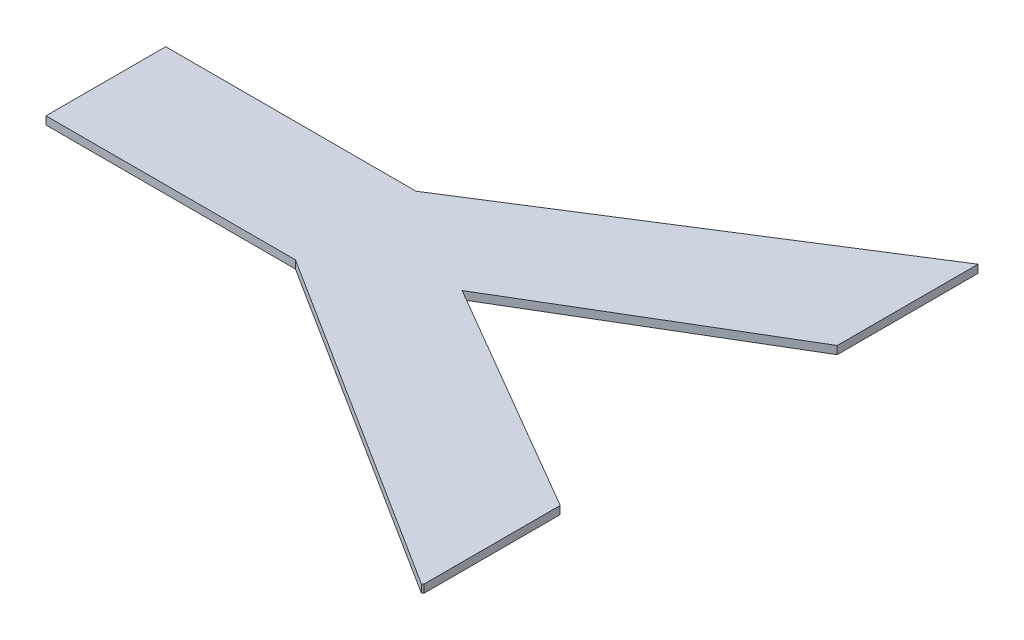
ISO-10303-21;
HEADER;
FILE_DESCRIPTION(('STEP AP214'),'2;1');
FILE_NAME('part.step','',(''),(''),'','','');
FILE_SCHEMA(('AUTOMOTIVE_DESIGN { 1 0 10303 214 1 1 1 1 }'));
ENDSEC;
DATA;
#1=APPLICATION_CONTEXT('core data for automotive mechanical design processes');
#2=APPLICATION_PROTOCOL_DEFINITION('international standard','automotive_design',2000,#1);
#3=PRODUCT_CONTEXT('',#1,'mechanical');
#4=PRODUCT('Part','Part','',(#3));
#5=PRODUCT_RELATED_PRODUCT_CATEGORY('part','',(#4));
#6=PRODUCT_DEFINITION_FORMATION('','',#4);
#7=PRODUCT_DEFINITION_CONTEXT('part definition',#1,'design');
#8=PRODUCT_DEFINITION('design','',#6,#7);
#9=PRODUCT_DEFINITION_SHAPE('','',#8);
#10=(LENGTH_UNIT() NAMED_UNIT(*) SI_UNIT(.MILLI.,.METRE.));
#11=(NAMED_UNIT(*) PLANE_ANGLE_UNIT() SI_UNIT($,.RADIAN.));
#12=(NAMED_UNIT(*) SI_UNIT($,.STERADIAN.) SOLID_ANGLE_UNIT());
#13=UNCERTAINTY_MEASURE_WITH_UNIT(LENGTH_MEASURE(1.E-05),#10,'distance_accuracy_value','');
#14=(GEOMETRIC_REPRESENTATION_CONTEXT(3) GLOBAL_UNCERTAINTY_ASSIGNED_CONTEXT((#13)) GLOBAL_UNIT_ASSIGNED_CONTEXT((#10,
#11,#12)) REPRESENTATION_CONTEXT('',''));
#15=CARTESIAN_POINT('',(0.,0.,0.));
#16=DIRECTION('',(0.,0.,1.));
#17=DIRECTION('',(1.,0.,0.));
#18=AXIS2_PLACEMENT_3D('',#15,#16,#17);
#19=CARTESIAN_POINT('',(-8.631267976045,2.15,0.));
#20=DIRECTION('',(0.,1.,0.));
#21=DIRECTION('',(0.,0.,1.));
#22=AXIS2_PLACEMENT_3D('',#19,#20,#21);
#23=PLANE('',#22);
#24=DIRECTION('',(1.,0.,0.));
#25=VECTOR('',#24,1.);
#26=CARTESIAN_POINT('',(-8.631267976045,2.15,-1.348127922221));
#27=LINE('',#26,#25);
#28=CARTESIAN_POINT('',(0.200543494761,2.15,-1.348127922221));
#29=VERTEX_POINT('',#28);
#30=CARTESIAN_POINT('',(0.512497096743813,2.15,-1.3481279222207));
#31=VERTEX_POINT('',#30);
#32=EDGE_CURVE('E151',#29,#31,#27,.T.);
#33=ORIENTED_EDGE('',*,*,#32,.F.);
#34=DIRECTION('',(0.,0.,1.));
#35=VECTOR('',#34,1.);
#36=CARTESIAN_POINT('',(0.200543494761,2.15,0.));
#37=LINE('',#36,#35);
#38=CARTESIAN_POINT('',(0.200543494761,2.15,-1.497817419804));
#39=VERTEX_POINT('',#38);
#40=EDGE_CURVE('E146',#39,#29,#37,.T.);
#41=ORIENTED_EDGE('',*,*,#40,.F.);
#42=DIRECTION('',(-1.,0.,0.));
#43=VECTOR('',#42,1.);
#44=CARTESIAN_POINT('',(-8.631267976045,2.15,-1.497817419804));
#45=LINE('',#44,#43);
#46=CARTESIAN_POINT('',(0.51353062607131,2.15,-1.49781741980351));
#47=VERTEX_POINT('',#46);
#48=EDGE_CURVE('E140',#47,#39,#45,.T.);
#49=ORIENTED_EDGE('',*,*,#48,.F.);
#50=DIRECTION('',(-0.845078836052363,0.,0.53464171260423));
#51=VECTOR('',#50,1.);
#52=CARTESIAN_POINT('',(-6.694038114073,2.15,3.062073007634));
#53=LINE('',#52,#51);
#54=CARTESIAN_POINT('',(0.943995590929294,2.15,-1.77015239757054));
#55=VERTEX_POINT('',#54);
#56=EDGE_CURVE('E134',#55,#47,#53,.T.);
#57=ORIENTED_EDGE('',*,*,#56,.F.);
#58=DIRECTION('',(0.,0.,-1.));
#59=VECTOR('',#58,1.);
#60=CARTESIAN_POINT('',(0.943995590929,2.15,0.));
#61=LINE('',#60,#59);
#62=CARTESIAN_POINT('',(0.943995590929144,2.15,-1.59410790213876));
#63=VERTEX_POINT('',#62);
#64=EDGE_CURVE('E128',#63,#55,#61,.T.);
#65=ORIENTED_EDGE('',*,*,#64,.F.);
#66=DIRECTION('',(0.859308687773046,0.,-0.511457309184027));
#67=VECTOR('',#66,1.);
#68=CARTESIAN_POINT('',(-6.827098344316,2.15,3.031218072207));
#69=LINE('',#68,#67);
#70=CARTESIAN_POINT('',(0.649956497287094,2.15,-1.41909693603453));
#71=VERTEX_POINT('',#70);
#72=EDGE_CURVE('E122',#71,#63,#69,.T.);
#73=ORIENTED_EDGE('',*,*,#72,.F.);
#74=DIRECTION('',(-0.86394406409241,0.,-0.503587781940239));
#75=VECTOR('',#74,1.);
#76=CARTESIAN_POINT('',(-5.660134497692,2.15,-5.097210902059));
#77=LINE('',#76,#75);
#78=CARTESIAN_POINT('',(0.943995590928954,2.15,-1.24770332257592));
#79=VERTEX_POINT('',#78);
#80=EDGE_CURVE('E116',#79,#71,#77,.T.);
#81=ORIENTED_EDGE('',*,*,#80,.F.);
#82=DIRECTION('',(0.,0.,-1.));
#83=VECTOR('',#82,1.);
#84=CARTESIAN_POINT('',(0.943995590929,2.15,0.));
#85=LINE('',#84,#83);
#86=CARTESIAN_POINT('',(0.943995590929349,2.15,-1.07734323844445));
#87=VERTEX_POINT('',#86);
#88=EDGE_CURVE('E92',#87,#79,#85,.T.);
#89=ORIENTED_EDGE('',*,*,#88,.F.);
#90=DIRECTION('',(-0.845078836052363,0.,0.53464171260423));
#91=VECTOR('',#90,1.);
#92=CARTESIAN_POINT('',(-6.381016962165,2.15,3.556848376778));
#93=LINE('',#92,#91);
#94=CARTESIAN_POINT('',(0.941954956039156,2.15,-1.07605222453414));
#95=VERTEX_POINT('',#94);
#96=EDGE_CURVE('E104',#87,#95,#93,.T.);
#97=ORIENTED_EDGE('',*,*,#96,.T.);
#98=DIRECTION('',(0.844742850910072,0.,0.535172416924045));
#99=VECTOR('',#98,1.);
#100=CARTESIAN_POINT('',(-5.402940834483,2.15,-5.095752671465));
#101=LINE('',#100,#99);
#102=EDGE_CURVE('E20',#31,#95,#101,.T.);
#103=ORIENTED_EDGE('',*,*,#102,.F.);
#104=EDGE_LOOP('',(#33,#41,#49,#57,#65,#73,#81,#89,#97,#103));
#105=FACE_BOUND('',#104,.T.);
#106=ADVANCED_FACE('F17',(#105),#23,.F.);
#107=CARTESIAN_POINT('',(-5.402940834483,2.16,-5.095752671465));
#108=DIRECTION('',(-0.535172416924045,0.,0.844742850910072));
#109=DIRECTION('',(0.844742850910072,0.,0.535172416924045));
#110=AXIS2_PLACEMENT_3D('',#107,#108,#109);
#111=PLANE('',#110);
#112=DIRECTION('',(0.844742850909348,0.,0.535172416925187));
#113=VECTOR('',#112,1.);
#114=CARTESIAN_POINT('',(0.512497096744001,2.16,-1.348127922221));
#115=LINE('',#114,#113);
#116=CARTESIAN_POINT('',(0.512497096743623,2.16,-1.3481279222204));
#117=VERTEX_POINT('',#116);
#118=CARTESIAN_POINT('',(0.941954956039157,2.16,-1.07605222453414));
#119=VERTEX_POINT('',#118);
#120=EDGE_CURVE('E155',#117,#119,#115,.T.);
#121=ORIENTED_EDGE('',*,*,#120,.F.);
#122=DIRECTION('',(0.,1.,0.));
#123=VECTOR('',#122,1.);
#124=CARTESIAN_POINT('',(0.512497096744001,2.16,-1.348127922221));
#125=LINE('',#124,#123);
#126=EDGE_CURVE('E102',#31,#117,#125,.T.);
#127=ORIENTED_EDGE('',*,*,#126,.F.);
#128=ORIENTED_EDGE('',*,*,#102,.T.);
#129=DIRECTION('',(0.,1.,0.));
#130=VECTOR('',#129,1.);
#131=CARTESIAN_POINT('',(0.941954956040398,2.16,-1.07605222453279));
#132=LINE('',#131,#130);
#133=EDGE_CURVE('E99',#95,#119,#132,.T.);
#134=ORIENTED_EDGE('',*,*,#133,.T.);
#135=EDGE_LOOP('',(#121,#127,#128,#134));
#136=FACE_BOUND('',#135,.T.);
#137=ADVANCED_FACE('F97',(#136),#111,.T.);
#138=CARTESIAN_POINT('',(-6.381016962165,2.16,3.556848376778));
#139=DIRECTION('',(-0.53464171260423,0.,-0.845078836052363));
#140=DIRECTION('',(-0.845078836052363,0.,0.53464171260423));
#141=AXIS2_PLACEMENT_3D('',#138,#139,#140);
#142=PLANE('',#141);
#143=DIRECTION('',(0.,1.,0.));
#144=VECTOR('',#143,1.);
#145=CARTESIAN_POINT('',(0.943995590929,2.16,-1.077343238445));
#146=LINE('',#145,#144);
#147=CARTESIAN_POINT('',(0.943995590929699,2.16,-1.07734323844389));
#148=VERTEX_POINT('',#147);
#149=EDGE_CURVE('E114',#148,#87,#146,.F.);
#150=ORIENTED_EDGE('',*,*,#149,.F.);
#151=DIRECTION('',(0.845078836052224,0.,-0.53464171260445));
#152=VECTOR('',#151,1.);
#153=CARTESIAN_POINT('',(0.941954956039,2.16,-1.076052224535));
#154=LINE('',#153,#152);
#155=EDGE_CURVE('E110',#119,#148,#154,.T.);
#156=ORIENTED_EDGE('',*,*,#155,.F.);
#157=ORIENTED_EDGE('',*,*,#133,.F.);
#158=ORIENTED_EDGE('',*,*,#96,.F.);
#159=EDGE_LOOP('',(#150,#156,#157,#158));
#160=FACE_BOUND('',#159,.T.);
#161=ADVANCED_FACE('F108',(#160),#142,.F.);
#162=CARTESIAN_POINT('',(0.943995590929,2.16,0.));
#163=DIRECTION('',(1.,0.,0.));
#164=DIRECTION('',(0.,0.,-1.));
#165=AXIS2_PLACEMENT_3D('',#162,#163,#164);
#166=PLANE('',#165);
#167=DIRECTION('',(0.,0.,1.));
#168=VECTOR('',#167,1.);
#169=CARTESIAN_POINT('',(0.943995590929,2.16,0.));
#170=LINE('',#169,#168);
#171=CARTESIAN_POINT('',(0.943995590928954,2.16,-1.24770332257592));
#172=VERTEX_POINT('',#171);
#173=EDGE_CURVE('E158',#148,#172,#170,.F.);
#174=ORIENTED_EDGE('',*,*,#173,.F.);
#175=ORIENTED_EDGE('',*,*,#149,.T.);
#176=ORIENTED_EDGE('',*,*,#88,.T.);
#177=DIRECTION('',(0.,1.,0.));
#178=VECTOR('',#177,1.);
#179=CARTESIAN_POINT('',(0.943995590928818,2.16,-1.24770332257568));
#180=LINE('',#179,#178);
#181=EDGE_CURVE('E119',#172,#79,#180,.F.);
#182=ORIENTED_EDGE('',*,*,#181,.F.);
#183=EDGE_LOOP('',(#174,#175,#176,#182));
#184=FACE_BOUND('',#183,.T.);
#185=ADVANCED_FACE('F197',(#184),#166,.T.);
#186=CARTESIAN_POINT('',(-5.660134497692,2.16,-5.097210902059));
#187=DIRECTION('',(0.503587781940239,0.,-0.86394406409241));
#188=DIRECTION('',(-0.86394406409241,0.,-0.503587781940239));
#189=AXIS2_PLACEMENT_3D('',#186,#187,#188);
#190=PLANE('',#189);
#191=DIRECTION('',(-0.863944064091879,0.,-0.503587781941151));
#192=VECTOR('',#191,1.);
#193=CARTESIAN_POINT('',(0.943995590929,2.16,-1.247703322576));
#194=LINE('',#193,#192);
#195=CARTESIAN_POINT('',(0.649956497287004,2.16,-1.41909693603438));
#196=VERTEX_POINT('',#195);
#197=EDGE_CURVE('E161',#172,#196,#194,.T.);
#198=ORIENTED_EDGE('',*,*,#197,.F.);
#199=ORIENTED_EDGE('',*,*,#181,.T.);
#200=ORIENTED_EDGE('',*,*,#80,.T.);
#201=DIRECTION('',(0.,1.,0.));
#202=VECTOR('',#201,1.);
#203=CARTESIAN_POINT('',(0.649956497287742,2.16,-1.41909693603375));
#204=LINE('',#203,#202);
#205=EDGE_CURVE('E125',#196,#71,#204,.F.);
#206=ORIENTED_EDGE('',*,*,#205,.F.);
#207=EDGE_LOOP('',(#198,#199,#200,#206));
#208=FACE_BOUND('',#207,.T.);
#209=ADVANCED_FACE('F194',(#208),#190,.T.);
#210=CARTESIAN_POINT('',(-6.827098344316,2.16,3.031218072207));
#211=DIRECTION('',(0.511457309184027,0.,0.859308687773046));
#212=DIRECTION('',(0.859308687773046,0.,-0.511457309184027));
#213=AXIS2_PLACEMENT_3D('',#210,#211,#212);
#214=PLANE('',#213);
#215=DIRECTION('',(0.859308687773533,0.,-0.511457309183209));
#216=VECTOR('',#215,1.);
#217=CARTESIAN_POINT('',(0.649956497287,2.16,-1.419096936035));
#218=LINE('',#217,#216);
#219=CARTESIAN_POINT('',(0.943995590929287,2.16,-1.59410790213852));
#220=VERTEX_POINT('',#219);
#221=EDGE_CURVE('E164',#196,#220,#218,.T.);
#222=ORIENTED_EDGE('',*,*,#221,.F.);
#223=ORIENTED_EDGE('',*,*,#205,.T.);
#224=ORIENTED_EDGE('',*,*,#72,.T.);
#225=DIRECTION('',(0.,1.,0.));
#226=VECTOR('',#225,1.);
#227=CARTESIAN_POINT('',(0.943995590929,2.16,-1.594107902139));
#228=LINE('',#227,#226);
#229=EDGE_CURVE('E131',#220,#63,#228,.F.);
#230=ORIENTED_EDGE('',*,*,#229,.F.);
#231=EDGE_LOOP('',(#222,#223,#224,#230));
#232=FACE_BOUND('',#231,.T.);
#233=ADVANCED_FACE('F191',(#232),#214,.T.);
#234=CARTESIAN_POINT('',(0.943995590929,2.16,0.));
#235=DIRECTION('',(1.,0.,0.));
#236=DIRECTION('',(0.,0.,-1.));
#237=AXIS2_PLACEMENT_3D('',#234,#235,#236);
#238=PLANE('',#237);
#239=DIRECTION('',(0.,0.,1.));
#240=VECTOR('',#239,1.);
#241=CARTESIAN_POINT('',(0.943995590929,2.16,0.));
#242=LINE('',#241,#240);
#243=CARTESIAN_POINT('',(0.943995590929294,2.16,-1.77015239757054));
#244=VERTEX_POINT('',#243);
#245=EDGE_CURVE('E167',#220,#244,#242,.F.);
#246=ORIENTED_EDGE('',*,*,#245,.F.);
#247=ORIENTED_EDGE('',*,*,#229,.T.);
#248=ORIENTED_EDGE('',*,*,#64,.T.);
#249=DIRECTION('',(0.,1.,0.));
#250=VECTOR('',#249,1.);
#251=CARTESIAN_POINT('',(0.943995590930176,2.16,-1.77015239756914));
#252=LINE('',#251,#250);
#253=EDGE_CURVE('E137',#244,#55,#252,.F.);
#254=ORIENTED_EDGE('',*,*,#253,.F.);
#255=EDGE_LOOP('',(#246,#247,#248,#254));
#256=FACE_BOUND('',#255,.T.);
#257=ADVANCED_FACE('F188',(#256),#238,.T.);
#258=CARTESIAN_POINT('',(-6.694038114073,2.16,3.062073007634));
#259=DIRECTION('',(-0.53464171260423,0.,-0.845078836052363));
#260=DIRECTION('',(-0.845078836052363,0.,0.53464171260423));
#261=AXIS2_PLACEMENT_3D('',#258,#259,#260);
#262=PLANE('',#261);
#263=DIRECTION('',(-0.845078836052486,0.,0.534641712604034));
#264=VECTOR('',#263,1.);
#265=CARTESIAN_POINT('',(0.943995590929,2.16,-1.770152397571));
#266=LINE('',#265,#264);
#267=CARTESIAN_POINT('',(0.51353062607162,2.16,-1.49781741980302));
#268=VERTEX_POINT('',#267);
#269=EDGE_CURVE('E170',#244,#268,#266,.T.);
#270=ORIENTED_EDGE('',*,*,#269,.F.);
#271=ORIENTED_EDGE('',*,*,#253,.T.);
#272=ORIENTED_EDGE('',*,*,#56,.T.);
#273=DIRECTION('',(0.,1.,0.));
#274=VECTOR('',#273,1.);
#275=CARTESIAN_POINT('',(0.513530626071001,2.16,-1.497817419804));
#276=LINE('',#275,#274);
#277=EDGE_CURVE('E143',#268,#47,#276,.F.);
#278=ORIENTED_EDGE('',*,*,#277,.F.);
#279=EDGE_LOOP('',(#270,#271,#272,#278));
#280=FACE_BOUND('',#279,.T.);
#281=ADVANCED_FACE('F185',(#280),#262,.T.);
#282=CARTESIAN_POINT('',(-8.631267976045,2.16,-1.497817419804));
#283=DIRECTION('',(0.,0.,-1.));
#284=DIRECTION('',(-1.,0.,0.));
#285=AXIS2_PLACEMENT_3D('',#282,#283,#284);
#286=PLANE('',#285);
#287=DIRECTION('',(1.,0.,0.));
#288=VECTOR('',#287,1.);
#289=CARTESIAN_POINT('',(-8.631267976045,2.16,-1.497817419804));
#290=LINE('',#289,#288);
#291=CARTESIAN_POINT('',(0.200543494761,2.16,-1.497817419804));
#292=VERTEX_POINT('',#291);
#293=EDGE_CURVE('E173',#268,#292,#290,.F.);
#294=ORIENTED_EDGE('',*,*,#293,.F.);
#295=ORIENTED_EDGE('',*,*,#277,.T.);
#296=ORIENTED_EDGE('',*,*,#48,.T.);
#297=DIRECTION('',(0.,1.,0.));
#298=VECTOR('',#297,1.);
#299=CARTESIAN_POINT('',(0.200543494761,2.16,-1.497817419804));
#300=LINE('',#299,#298);
#301=EDGE_CURVE('E148',#292,#39,#300,.F.);
#302=ORIENTED_EDGE('',*,*,#301,.F.);
#303=EDGE_LOOP('',(#294,#295,#296,#302));
#304=FACE_BOUND('',#303,.T.);
#305=ADVANCED_FACE('F182',(#304),#286,.T.);
#306=CARTESIAN_POINT('',(0.200543494761,2.16,0.));
#307=DIRECTION('',(-1.,0.,0.));
#308=DIRECTION('',(0.,0.,1.));
#309=AXIS2_PLACEMENT_3D('',#306,#307,#308);
#310=PLANE('',#309);
#311=DIRECTION('',(0.,0.,1.));
#312=VECTOR('',#311,1.);
#313=CARTESIAN_POINT('',(0.200543494761,2.16,0.));
#314=LINE('',#313,#312);
#315=CARTESIAN_POINT('',(0.200543494761,2.16,-1.348127922221));
#316=VERTEX_POINT('',#315);
#317=EDGE_CURVE('E26',#292,#316,#314,.T.);
#318=ORIENTED_EDGE('',*,*,#317,.F.);
#319=ORIENTED_EDGE('',*,*,#301,.T.);
#320=ORIENTED_EDGE('',*,*,#40,.T.);
#321=DIRECTION('',(0.,1.,0.));
#322=VECTOR('',#321,1.);
#323=CARTESIAN_POINT('',(0.200543494761,2.16,-1.348127922221));
#324=LINE('',#323,#322);
#325=EDGE_CURVE('E35',#316,#29,#324,.F.);
#326=ORIENTED_EDGE('',*,*,#325,.F.);
#327=EDGE_LOOP('',(#318,#319,#320,#326));
#328=FACE_BOUND('',#327,.T.);
#329=ADVANCED_FACE('F180',(#328),#310,.T.);
#330=CARTESIAN_POINT('',(-8.631267976045,2.16,-1.348127922221));
#331=DIRECTION('',(0.,0.,1.));
#332=DIRECTION('',(1.,0.,0.));
#333=AXIS2_PLACEMENT_3D('',#330,#331,#332);
#334=PLANE('',#333);
#335=DIRECTION('',(1.,0.,0.));
#336=VECTOR('',#335,1.);
#337=CARTESIAN_POINT('',(-8.631267976045,2.16,-1.348127922221));
#338=LINE('',#337,#336);
#339=EDGE_CURVE('E11',#316,#117,#338,.T.);
#340=ORIENTED_EDGE('',*,*,#339,.F.);
#341=ORIENTED_EDGE('',*,*,#325,.T.);
#342=ORIENTED_EDGE('',*,*,#32,.T.);
#343=ORIENTED_EDGE('',*,*,#126,.T.);
#344=EDGE_LOOP('',(#340,#341,#342,#343));
#345=FACE_BOUND('',#344,.T.);
#346=ADVANCED_FACE('F199',(#345),#334,.T.);
#347=CARTESIAN_POINT('',(-8.631267976045,2.16,0.));
#348=DIRECTION('',(0.,1.,0.));
#349=DIRECTION('',(0.,0.,1.));
#350=AXIS2_PLACEMENT_3D('',#347,#348,#349);
#351=PLANE('',#350);
#352=ORIENTED_EDGE('',*,*,#317,.T.);
#353=ORIENTED_EDGE('',*,*,#339,.T.);
#354=ORIENTED_EDGE('',*,*,#120,.T.);
#355=ORIENTED_EDGE('',*,*,#155,.T.);
#356=ORIENTED_EDGE('',*,*,#173,.T.);
#357=ORIENTED_EDGE('',*,*,#197,.T.);
#358=ORIENTED_EDGE('',*,*,#221,.T.);
#359=ORIENTED_EDGE('',*,*,#245,.T.);
#360=ORIENTED_EDGE('',*,*,#269,.T.);
#361=ORIENTED_EDGE('',*,*,#293,.T.);
#362=EDGE_LOOP('',(#352,#353,#354,#355,#356,#357,#358,#359,#360,#361));
#363=FACE_BOUND('',#362,.T.);
#364=ADVANCED_FACE('F178',(#363),#351,.T.);
#365=CLOSED_SHELL('',(#106,#137,#161,#185,#209,#233,#257,#281,#305,#329,#346,#364));
#366=MANIFOLD_SOLID_BREP('B1',#365);
#367=ADVANCED_BREP_SHAPE_REPRESENTATION('',(#18,#366),#14);
#368=SHAPE_DEFINITION_REPRESENTATION(#9,#367);
ENDSEC;
END-ISO-10303-21;
